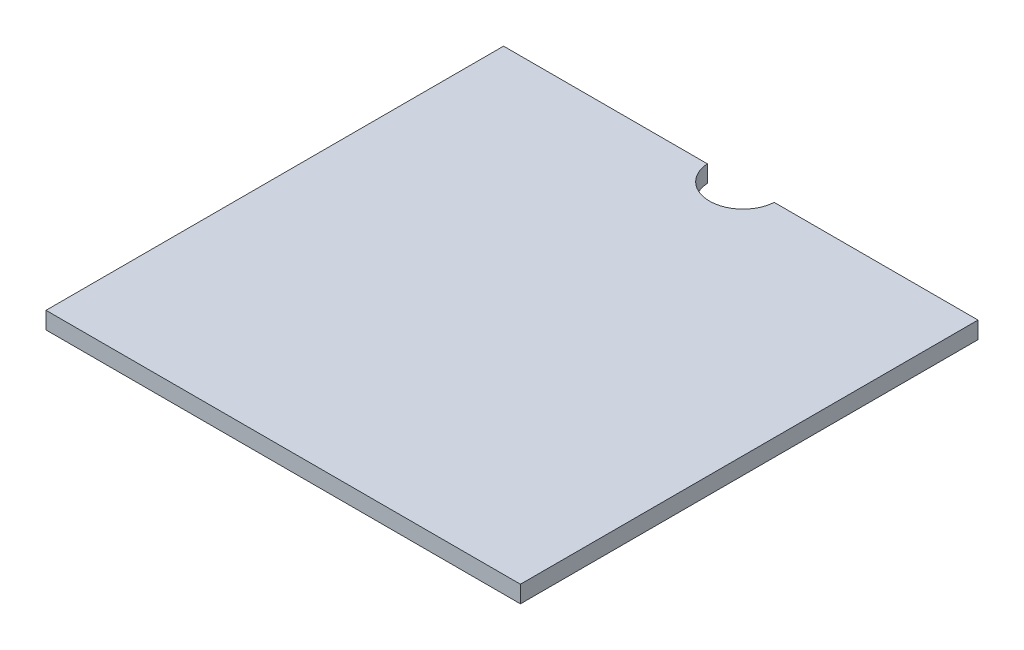
ISO-10303-21;
HEADER;
FILE_DESCRIPTION(('STEP AP214'),'2;1');
FILE_NAME('part.step','',(''),(''),'','','');
FILE_SCHEMA(('AUTOMOTIVE_DESIGN { 1 0 10303 214 1 1 1 1 }'));
ENDSEC;
DATA;
#1=APPLICATION_CONTEXT('core data for automotive mechanical design processes');
#2=APPLICATION_PROTOCOL_DEFINITION('international standard','automotive_design',2000,#1);
#3=PRODUCT_CONTEXT('',#1,'mechanical');
#4=PRODUCT('Part','Part','',(#3));
#5=PRODUCT_RELATED_PRODUCT_CATEGORY('part','',(#4));
#6=PRODUCT_DEFINITION_FORMATION('','',#4);
#7=PRODUCT_DEFINITION_CONTEXT('part definition',#1,'design');
#8=PRODUCT_DEFINITION('design','',#6,#7);
#9=PRODUCT_DEFINITION_SHAPE('','',#8);
#10=(LENGTH_UNIT() NAMED_UNIT(*) SI_UNIT(.MILLI.,.METRE.));
#11=(NAMED_UNIT(*) PLANE_ANGLE_UNIT() SI_UNIT($,.RADIAN.));
#12=(NAMED_UNIT(*) SI_UNIT($,.STERADIAN.) SOLID_ANGLE_UNIT());
#13=UNCERTAINTY_MEASURE_WITH_UNIT(LENGTH_MEASURE(1.E-05),#10,'distance_accuracy_value','');
#14=(GEOMETRIC_REPRESENTATION_CONTEXT(3) GLOBAL_UNCERTAINTY_ASSIGNED_CONTEXT((#13)) GLOBAL_UNIT_ASSIGNED_CONTEXT((#10,
#11,#12)) REPRESENTATION_CONTEXT('',''));
#15=CARTESIAN_POINT('',(0.,0.,0.));
#16=DIRECTION('',(0.,0.,1.));
#17=DIRECTION('',(1.,0.,0.));
#18=AXIS2_PLACEMENT_3D('',#15,#16,#17);
#19=CARTESIAN_POINT('',(-248.209907834102,0.,-56.61));
#20=DIRECTION('',(1.,0.,0.));
#21=DIRECTION('',(0.,0.,-1.));
#22=AXIS2_PLACEMENT_3D('',#19,#20,#21);
#23=PLANE('',#22);
#24=DIRECTION('',(0.,0.,-1.));
#25=VECTOR('',#24,1.);
#26=CARTESIAN_POINT('',(-248.209907834102,4.064,-56.61));
#27=LINE('',#26,#25);
#28=CARTESIAN_POINT('',(-248.209907834102,4.064,52.546));
#29=VERTEX_POINT('',#28);
#30=CARTESIAN_POINT('',(-248.209907834102,4.064,-56.61));
#31=VERTEX_POINT('',#30);
#32=EDGE_CURVE('E117',#29,#31,#27,.T.);
#33=ORIENTED_EDGE('',*,*,#32,.F.);
#34=DIRECTION('',(0.,1.,0.));
#35=VECTOR('',#34,1.);
#36=CARTESIAN_POINT('',(-248.209907834102,0.,52.546));
#37=LINE('',#36,#35);
#38=CARTESIAN_POINT('',(-248.209907834102,0.,52.546));
#39=VERTEX_POINT('',#38);
#40=EDGE_CURVE('E11',#39,#29,#37,.T.);
#41=ORIENTED_EDGE('',*,*,#40,.F.);
#42=DIRECTION('',(0.,0.,-1.));
#43=VECTOR('',#42,1.);
#44=CARTESIAN_POINT('',(-248.209907834102,0.,-56.61));
#45=LINE('',#44,#43);
#46=CARTESIAN_POINT('',(-248.209907834102,0.,-56.61));
#47=VERTEX_POINT('',#46);
#48=EDGE_CURVE('E131',#39,#47,#45,.T.);
#49=ORIENTED_EDGE('',*,*,#48,.T.);
#50=DIRECTION('',(0.,1.,0.));
#51=VECTOR('',#50,1.);
#52=CARTESIAN_POINT('',(-248.209907834102,0.,-56.61));
#53=LINE('',#52,#51);
#54=EDGE_CURVE('E35',#47,#31,#53,.T.);
#55=ORIENTED_EDGE('',*,*,#54,.T.);
#56=EDGE_LOOP('',(#33,#41,#49,#55));
#57=FACE_BOUND('',#56,.T.);
#58=ADVANCED_FACE('F32',(#57),#23,.T.);
#59=CARTESIAN_POINT('',(-361.390092165898,0.,52.546));
#60=DIRECTION('',(0.,0.,1.));
#61=DIRECTION('',(1.,0.,0.));
#62=AXIS2_PLACEMENT_3D('',#59,#60,#61);
#63=PLANE('',#62);
#64=DIRECTION('',(1.,0.,0.));
#65=VECTOR('',#64,1.);
#66=CARTESIAN_POINT('',(-361.390092165898,4.064,52.546));
#67=LINE('',#66,#65);
#68=CARTESIAN_POINT('',(-361.390092165898,4.064,52.546));
#69=VERTEX_POINT('',#68);
#70=EDGE_CURVE('E129',#69,#29,#67,.T.);
#71=ORIENTED_EDGE('',*,*,#70,.F.);
#72=DIRECTION('',(0.,1.,0.));
#73=VECTOR('',#72,1.);
#74=CARTESIAN_POINT('',(-361.390092165898,0.,52.546));
#75=LINE('',#74,#73);
#76=CARTESIAN_POINT('',(-361.390092165898,0.,52.546));
#77=VERTEX_POINT('',#76);
#78=EDGE_CURVE('E41',#77,#69,#75,.T.);
#79=ORIENTED_EDGE('',*,*,#78,.F.);
#80=DIRECTION('',(1.,0.,0.));
#81=VECTOR('',#80,1.);
#82=CARTESIAN_POINT('',(-361.390092165898,0.,52.546));
#83=LINE('',#82,#81);
#84=EDGE_CURVE('E107',#77,#39,#83,.T.);
#85=ORIENTED_EDGE('',*,*,#84,.T.);
#86=ORIENTED_EDGE('',*,*,#40,.T.);
#87=EDGE_LOOP('',(#71,#79,#85,#86));
#88=FACE_BOUND('',#87,.T.);
#89=ADVANCED_FACE('F139',(#88),#63,.T.);
#90=CARTESIAN_POINT('',(-361.390092165898,0.,-56.61));
#91=DIRECTION('',(-1.,0.,0.));
#92=DIRECTION('',(0.,0.,1.));
#93=AXIS2_PLACEMENT_3D('',#90,#91,#92);
#94=PLANE('',#93);
#95=DIRECTION('',(0.,0.,1.));
#96=VECTOR('',#95,1.);
#97=CARTESIAN_POINT('',(-361.390092165898,4.064,-56.61));
#98=LINE('',#97,#96);
#99=CARTESIAN_POINT('',(-361.390092165898,4.064,-56.61));
#100=VERTEX_POINT('',#99);
#101=EDGE_CURVE('E94',#100,#69,#98,.T.);
#102=ORIENTED_EDGE('',*,*,#101,.F.);
#103=DIRECTION('',(0.,1.,0.));
#104=VECTOR('',#103,1.);
#105=CARTESIAN_POINT('',(-361.390092165898,0.,-56.61));
#106=LINE('',#105,#104);
#107=CARTESIAN_POINT('',(-361.390092165898,0.,-56.61));
#108=VERTEX_POINT('',#107);
#109=EDGE_CURVE('E89',#108,#100,#106,.T.);
#110=ORIENTED_EDGE('',*,*,#109,.F.);
#111=DIRECTION('',(0.,0.,1.));
#112=VECTOR('',#111,1.);
#113=CARTESIAN_POINT('',(-361.390092165898,0.,-56.61));
#114=LINE('',#113,#112);
#115=EDGE_CURVE('E92',#108,#77,#114,.T.);
#116=ORIENTED_EDGE('',*,*,#115,.T.);
#117=ORIENTED_EDGE('',*,*,#78,.T.);
#118=EDGE_LOOP('',(#102,#110,#116,#117));
#119=FACE_BOUND('',#118,.T.);
#120=ADVANCED_FACE('F91',(#119),#94,.T.);
#121=CARTESIAN_POINT('',(-361.390092165898,0.,-56.61));
#122=DIRECTION('',(0.,0.,-1.));
#123=DIRECTION('',(-1.,0.,0.));
#124=AXIS2_PLACEMENT_3D('',#121,#122,#123);
#125=PLANE('',#124);
#126=DIRECTION('',(-1.,0.,0.));
#127=VECTOR('',#126,1.);
#128=CARTESIAN_POINT('',(-361.390092165898,4.064,-56.61));
#129=LINE('',#128,#127);
#130=CARTESIAN_POINT('',(-312.781754193158,4.064,-56.61));
#131=VERTEX_POINT('',#130);
#132=EDGE_CURVE('E126',#131,#100,#129,.T.);
#133=ORIENTED_EDGE('',*,*,#132,.F.);
#134=DIRECTION('',(0.,1.,0.));
#135=VECTOR('',#134,1.);
#136=CARTESIAN_POINT('',(-312.781754193158,0.,-56.61));
#137=LINE('',#136,#135);
#138=CARTESIAN_POINT('',(-312.781754193158,0.,-56.61));
#139=VERTEX_POINT('',#138);
#140=EDGE_CURVE('E99',#139,#131,#137,.T.);
#141=ORIENTED_EDGE('',*,*,#140,.F.);
#142=DIRECTION('',(-1.,0.,0.));
#143=VECTOR('',#142,1.);
#144=CARTESIAN_POINT('',(-361.390092165898,0.,-56.61));
#145=LINE('',#144,#143);
#146=EDGE_CURVE('E105',#139,#108,#145,.T.);
#147=ORIENTED_EDGE('',*,*,#146,.T.);
#148=ORIENTED_EDGE('',*,*,#109,.T.);
#149=EDGE_LOOP('',(#133,#141,#147,#148));
#150=FACE_BOUND('',#149,.T.);
#151=ADVANCED_FACE('F109',(#150),#125,.T.);
#152=CARTESIAN_POINT('',(-304.8,0.,-57.15));
#153=DIRECTION('',(0.,1.,0.));
#154=DIRECTION('',(0.,0.,1.));
#155=AXIS2_PLACEMENT_3D('',#152,#153,#154);
#156=CYLINDRICAL_SURFACE('',#155,7.99999999999998);
#157=CARTESIAN_POINT('',(-304.8,4.064,-57.15));
#158=DIRECTION('',(0.,-1.,0.));
#159=DIRECTION('',(0.,0.,1.));
#160=AXIS2_PLACEMENT_3D('',#157,#158,#159);
#161=CIRCLE('',#160,7.99999999999998);
#162=CARTESIAN_POINT('',(-296.818245806842,4.064,-56.61));
#163=VERTEX_POINT('',#162);
#164=EDGE_CURVE('E123',#163,#131,#161,.T.);
#165=ORIENTED_EDGE('',*,*,#164,.F.);
#166=DIRECTION('',(0.,1.,0.));
#167=VECTOR('',#166,1.);
#168=CARTESIAN_POINT('',(-296.818245806842,0.,-56.61));
#169=LINE('',#168,#167);
#170=CARTESIAN_POINT('',(-296.818245806842,0.,-56.61));
#171=VERTEX_POINT('',#170);
#172=EDGE_CURVE('E134',#171,#163,#169,.T.);
#173=ORIENTED_EDGE('',*,*,#172,.F.);
#174=CARTESIAN_POINT('',(-304.8,0.,-57.15));
#175=DIRECTION('',(0.,-1.,0.));
#176=DIRECTION('',(0.,0.,1.));
#177=AXIS2_PLACEMENT_3D('',#174,#175,#176);
#178=CIRCLE('',#177,7.99999999999998);
#179=EDGE_CURVE('E110',#171,#139,#178,.T.);
#180=ORIENTED_EDGE('',*,*,#179,.T.);
#181=ORIENTED_EDGE('',*,*,#140,.T.);
#182=EDGE_LOOP('',(#165,#173,#180,#181));
#183=FACE_BOUND('',#182,.T.);
#184=ADVANCED_FACE('F152',(#183),#156,.F.);
#185=CARTESIAN_POINT('',(-296.818245806842,0.,-56.61));
#186=DIRECTION('',(0.,0.,-1.));
#187=DIRECTION('',(-1.,0.,0.));
#188=AXIS2_PLACEMENT_3D('',#185,#186,#187);
#189=PLANE('',#188);
#190=DIRECTION('',(-1.,0.,0.));
#191=VECTOR('',#190,1.);
#192=CARTESIAN_POINT('',(-296.818245806842,4.064,-56.61));
#193=LINE('',#192,#191);
#194=EDGE_CURVE('E120',#31,#163,#193,.T.);
#195=ORIENTED_EDGE('',*,*,#194,.F.);
#196=ORIENTED_EDGE('',*,*,#54,.F.);
#197=DIRECTION('',(-1.,0.,0.));
#198=VECTOR('',#197,1.);
#199=CARTESIAN_POINT('',(-296.818245806842,0.,-56.61));
#200=LINE('',#199,#198);
#201=EDGE_CURVE('E112',#47,#171,#200,.T.);
#202=ORIENTED_EDGE('',*,*,#201,.T.);
#203=ORIENTED_EDGE('',*,*,#172,.T.);
#204=EDGE_LOOP('',(#195,#196,#202,#203));
#205=FACE_BOUND('',#204,.T.);
#206=ADVANCED_FACE('F136',(#205),#189,.T.);
#207=CARTESIAN_POINT('',(-304.8,0.,-57.15));
#208=DIRECTION('',(0.,1.,0.));
#209=DIRECTION('',(0.,0.,1.));
#210=AXIS2_PLACEMENT_3D('',#207,#208,#209);
#211=PLANE('',#210);
#212=ORIENTED_EDGE('',*,*,#48,.F.);
#213=ORIENTED_EDGE('',*,*,#84,.F.);
#214=ORIENTED_EDGE('',*,*,#115,.F.);
#215=ORIENTED_EDGE('',*,*,#146,.F.);
#216=ORIENTED_EDGE('',*,*,#179,.F.);
#217=ORIENTED_EDGE('',*,*,#201,.F.);
#218=EDGE_LOOP('',(#212,#213,#214,#215,#216,#217));
#219=FACE_BOUND('',#218,.T.);
#220=ADVANCED_FACE('F103',(#219),#211,.F.);
#221=CARTESIAN_POINT('',(-304.8,4.064,-57.15));
#222=DIRECTION('',(0.,1.,0.));
#223=DIRECTION('',(0.,0.,1.));
#224=AXIS2_PLACEMENT_3D('',#221,#222,#223);
#225=PLANE('',#224);
#226=ORIENTED_EDGE('',*,*,#32,.T.);
#227=ORIENTED_EDGE('',*,*,#194,.T.);
#228=ORIENTED_EDGE('',*,*,#164,.T.);
#229=ORIENTED_EDGE('',*,*,#132,.T.);
#230=ORIENTED_EDGE('',*,*,#101,.T.);
#231=ORIENTED_EDGE('',*,*,#70,.T.);
#232=EDGE_LOOP('',(#226,#227,#228,#229,#230,#231));
#233=FACE_BOUND('',#232,.T.);
#234=ADVANCED_FACE('F138',(#233),#225,.T.);
#235=CLOSED_SHELL('',(#58,#89,#120,#151,#184,#206,#220,#234));
#236=MANIFOLD_SOLID_BREP('B2',#235);
#237=ADVANCED_BREP_SHAPE_REPRESENTATION('',(#18,#236),#14);
#238=SHAPE_DEFINITION_REPRESENTATION(#9,#237);
ENDSEC;
END-ISO-10303-21;
